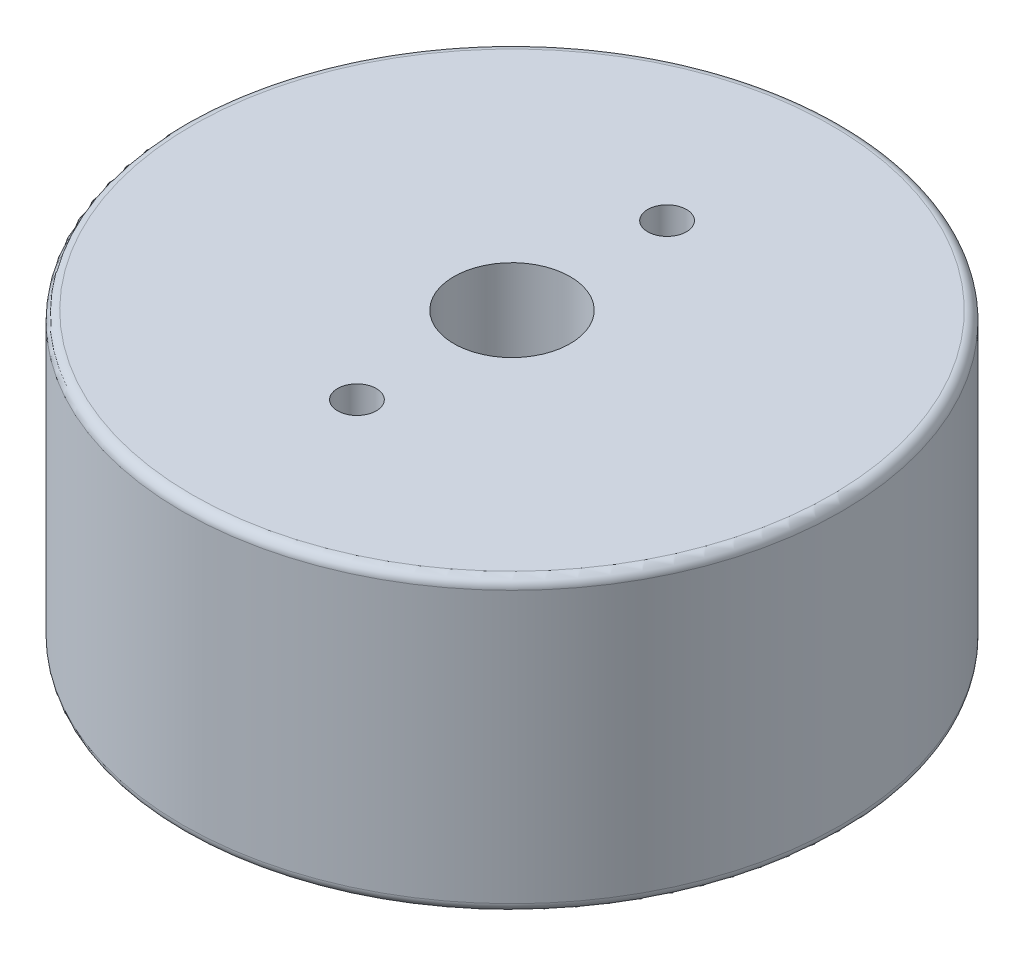
ISO-10303-21;
HEADER;
FILE_DESCRIPTION(('STEP AP214'),'2;1');
FILE_NAME('part.step','',(''),(''),'','','');
FILE_SCHEMA(('AUTOMOTIVE_DESIGN { 1 0 10303 214 1 1 1 1 }'));
ENDSEC;
DATA;
#1=APPLICATION_CONTEXT('core data for automotive mechanical design processes');
#2=APPLICATION_PROTOCOL_DEFINITION('international standard','automotive_design',2000,#1);
#3=PRODUCT_CONTEXT('',#1,'mechanical');
#4=PRODUCT('Part','Part','',(#3));
#5=PRODUCT_RELATED_PRODUCT_CATEGORY('part','',(#4));
#6=PRODUCT_DEFINITION_FORMATION('','',#4);
#7=PRODUCT_DEFINITION_CONTEXT('part definition',#1,'design');
#8=PRODUCT_DEFINITION('design','',#6,#7);
#9=PRODUCT_DEFINITION_SHAPE('','',#8);
#10=(LENGTH_UNIT() NAMED_UNIT(*) SI_UNIT(.MILLI.,.METRE.));
#11=(NAMED_UNIT(*) PLANE_ANGLE_UNIT() SI_UNIT($,.RADIAN.));
#12=(NAMED_UNIT(*) SI_UNIT($,.STERADIAN.) SOLID_ANGLE_UNIT());
#13=UNCERTAINTY_MEASURE_WITH_UNIT(LENGTH_MEASURE(1.E-05),#10,'distance_accuracy_value','');
#14=(GEOMETRIC_REPRESENTATION_CONTEXT(3) GLOBAL_UNCERTAINTY_ASSIGNED_CONTEXT((#13)) GLOBAL_UNIT_ASSIGNED_CONTEXT((#10,
#11,#12)) REPRESENTATION_CONTEXT('',''));
#15=CARTESIAN_POINT('',(0.,0.,0.));
#16=DIRECTION('',(0.,0.,1.));
#17=DIRECTION('',(1.,0.,0.));
#18=AXIS2_PLACEMENT_3D('',#15,#16,#17);
#19=CARTESIAN_POINT('',(0.,15.,0.));
#20=DIRECTION('',(0.,-1.,0.));
#21=DIRECTION('',(0.,0.,-1.));
#22=AXIS2_PLACEMENT_3D('',#19,#20,#21);
#23=CYLINDRICAL_SURFACE('',#22,17.);
#24=CARTESIAN_POINT('',(0.,0.5,0.));
#25=DIRECTION('',(0.,1.,0.));
#26=DIRECTION('',(0.,0.,1.));
#27=AXIS2_PLACEMENT_3D('',#24,#25,#26);
#28=CIRCLE('',#27,17.);
#29=CARTESIAN_POINT('',(0.,0.5,17.));
#30=VERTEX_POINT('',#29);
#31=EDGE_CURVE('E48',#30,#30,#28,.T.);
#32=ORIENTED_EDGE('',*,*,#31,.T.);
#33=EDGE_LOOP('',(#32));
#34=FACE_BOUND('',#33,.T.);
#35=CARTESIAN_POINT('',(0.,14.5,0.));
#36=DIRECTION('',(0.,1.,0.));
#37=DIRECTION('',(0.,0.,1.));
#38=AXIS2_PLACEMENT_3D('',#35,#36,#37);
#39=CIRCLE('',#38,17.);
#40=CARTESIAN_POINT('',(0.,14.5,17.));
#41=VERTEX_POINT('',#40);
#42=EDGE_CURVE('E52',#41,#41,#39,.F.);
#43=ORIENTED_EDGE('',*,*,#42,.T.);
#44=EDGE_LOOP('',(#43));
#45=FACE_BOUND('',#44,.T.);
#46=ADVANCED_FACE('F37',(#34,#45),#23,.T.);
#47=CARTESIAN_POINT('',(0.,15.,0.));
#48=DIRECTION('',(0.,1.,0.));
#49=DIRECTION('',(0.,0.,1.));
#50=AXIS2_PLACEMENT_3D('',#47,#48,#49);
#51=PLANE('',#50);
#52=CARTESIAN_POINT('',(0.,15.,0.));
#53=DIRECTION('',(0.,1.,0.));
#54=DIRECTION('',(0.,0.,1.));
#55=AXIS2_PLACEMENT_3D('',#52,#53,#54);
#56=CIRCLE('',#55,16.5);
#57=CARTESIAN_POINT('',(0.,15.,16.5));
#58=VERTEX_POINT('',#57);
#59=EDGE_CURVE('E10',#58,#58,#56,.T.);
#60=ORIENTED_EDGE('',*,*,#59,.T.);
#61=EDGE_LOOP('',(#60));
#62=FACE_BOUND('',#61,.T.);
#63=CARTESIAN_POINT('',(0.,15.,0.));
#64=DIRECTION('',(0.,1.,0.));
#65=DIRECTION('',(0.,0.,1.));
#66=AXIS2_PLACEMENT_3D('',#63,#64,#65);
#67=CIRCLE('',#66,3.);
#68=CARTESIAN_POINT('',(0.,15.,-3.));
#69=VERTEX_POINT('',#68);
#70=EDGE_CURVE('E94',#69,#69,#67,.F.);
#71=ORIENTED_EDGE('',*,*,#70,.T.);
#72=EDGE_LOOP('',(#71));
#73=FACE_BOUND('',#72,.T.);
#74=CARTESIAN_POINT('',(0.,15.,-8.));
#75=DIRECTION('',(0.,1.,0.));
#76=DIRECTION('',(0.,0.,1.));
#77=AXIS2_PLACEMENT_3D('',#74,#75,#76);
#78=CIRCLE('',#77,1.);
#79=CARTESIAN_POINT('',(0.,15.,-7.));
#80=VERTEX_POINT('',#79);
#81=EDGE_CURVE('E65',#80,#80,#78,.T.);
#82=ORIENTED_EDGE('',*,*,#81,.F.);
#83=EDGE_LOOP('',(#82));
#84=FACE_BOUND('',#83,.T.);
#85=CARTESIAN_POINT('',(0.,15.,8.));
#86=DIRECTION('',(0.,1.,0.));
#87=DIRECTION('',(0.,0.,1.));
#88=AXIS2_PLACEMENT_3D('',#85,#86,#87);
#89=CIRCLE('',#88,1.);
#90=CARTESIAN_POINT('',(0.,15.,9.));
#91=VERTEX_POINT('',#90);
#92=EDGE_CURVE('E61',#91,#91,#89,.T.);
#93=ORIENTED_EDGE('',*,*,#92,.F.);
#94=EDGE_LOOP('',(#93));
#95=FACE_BOUND('',#94,.T.);
#96=ADVANCED_FACE('F106',(#62,#73,#84,#95),#51,.T.);
#97=CARTESIAN_POINT('',(0.,0.,0.));
#98=DIRECTION('',(0.,1.,0.));
#99=DIRECTION('',(0.,0.,1.));
#100=AXIS2_PLACEMENT_3D('',#97,#98,#99);
#101=PLANE('',#100);
#102=CARTESIAN_POINT('',(0.,0.,0.));
#103=DIRECTION('',(0.,1.,0.));
#104=DIRECTION('',(0.,0.,1.));
#105=AXIS2_PLACEMENT_3D('',#102,#103,#104);
#106=CIRCLE('',#105,16.5);
#107=CARTESIAN_POINT('',(0.,0.,16.5));
#108=VERTEX_POINT('',#107);
#109=EDGE_CURVE('E44',#108,#108,#106,.F.);
#110=ORIENTED_EDGE('',*,*,#109,.T.);
#111=EDGE_LOOP('',(#110));
#112=FACE_BOUND('',#111,.T.);
#113=CARTESIAN_POINT('',(0.,0.,0.));
#114=DIRECTION('',(0.,-1.,0.));
#115=DIRECTION('',(0.,0.,-1.));
#116=AXIS2_PLACEMENT_3D('',#113,#114,#115);
#117=CIRCLE('',#116,3.);
#118=CARTESIAN_POINT('',(0.,0.,-3.));
#119=VERTEX_POINT('',#118);
#120=EDGE_CURVE('E74',#119,#119,#117,.T.);
#121=ORIENTED_EDGE('',*,*,#120,.F.);
#122=EDGE_LOOP('',(#121));
#123=FACE_BOUND('',#122,.T.);
#124=CARTESIAN_POINT('',(0.,0.,8.));
#125=DIRECTION('',(0.,-1.,0.));
#126=DIRECTION('',(0.,0.,-1.));
#127=AXIS2_PLACEMENT_3D('',#124,#125,#126);
#128=CIRCLE('',#127,1.5);
#129=CARTESIAN_POINT('',(0.,0.,6.5));
#130=VERTEX_POINT('',#129);
#131=EDGE_CURVE('E89',#130,#130,#128,.T.);
#132=ORIENTED_EDGE('',*,*,#131,.F.);
#133=EDGE_LOOP('',(#132));
#134=FACE_BOUND('',#133,.T.);
#135=CARTESIAN_POINT('',(8.,0.,0.));
#136=DIRECTION('',(0.,-1.,0.));
#137=DIRECTION('',(0.,0.,-1.));
#138=AXIS2_PLACEMENT_3D('',#135,#136,#137);
#139=CIRCLE('',#138,1.5);
#140=CARTESIAN_POINT('',(8.,0.,-1.5));
#141=VERTEX_POINT('',#140);
#142=EDGE_CURVE('E86',#141,#141,#139,.T.);
#143=ORIENTED_EDGE('',*,*,#142,.F.);
#144=EDGE_LOOP('',(#143));
#145=FACE_BOUND('',#144,.T.);
#146=CARTESIAN_POINT('',(0.,0.,-8.));
#147=DIRECTION('',(0.,-1.,0.));
#148=DIRECTION('',(0.,0.,-1.));
#149=AXIS2_PLACEMENT_3D('',#146,#147,#148);
#150=CIRCLE('',#149,1.5);
#151=CARTESIAN_POINT('',(0.,0.,-9.5));
#152=VERTEX_POINT('',#151);
#153=EDGE_CURVE('E80',#152,#152,#150,.T.);
#154=ORIENTED_EDGE('',*,*,#153,.F.);
#155=EDGE_LOOP('',(#154));
#156=FACE_BOUND('',#155,.T.);
#157=CARTESIAN_POINT('',(-8.,0.,0.));
#158=DIRECTION('',(0.,-1.,0.));
#159=DIRECTION('',(0.,0.,-1.));
#160=AXIS2_PLACEMENT_3D('',#157,#158,#159);
#161=CIRCLE('',#160,1.5);
#162=CARTESIAN_POINT('',(-8.,0.,-1.5));
#163=VERTEX_POINT('',#162);
#164=EDGE_CURVE('E73',#163,#163,#161,.T.);
#165=ORIENTED_EDGE('',*,*,#164,.F.);
#166=EDGE_LOOP('',(#165));
#167=FACE_BOUND('',#166,.T.);
#168=ADVANCED_FACE('F102',(#112,#123,#134,#145,#156,#167),#101,.F.);
#169=CARTESIAN_POINT('',(0.,5.,8.));
#170=DIRECTION('',(0.,1.,0.));
#171=DIRECTION('',(0.,0.,1.));
#172=AXIS2_PLACEMENT_3D('',#169,#170,#171);
#173=CYLINDRICAL_SURFACE('',#172,1.);
#174=CARTESIAN_POINT('',(0.,5.,8.));
#175=DIRECTION('',(0.,1.,0.));
#176=DIRECTION('',(0.,0.,1.));
#177=AXIS2_PLACEMENT_3D('',#174,#175,#176);
#178=CIRCLE('',#177,1.);
#179=CARTESIAN_POINT('',(0.,5.,9.));
#180=VERTEX_POINT('',#179);
#181=EDGE_CURVE('E58',#180,#180,#178,.T.);
#182=ORIENTED_EDGE('',*,*,#181,.F.);
#183=EDGE_LOOP('',(#182));
#184=FACE_BOUND('',#183,.T.);
#185=ORIENTED_EDGE('',*,*,#92,.T.);
#186=EDGE_LOOP('',(#185));
#187=FACE_BOUND('',#186,.T.);
#188=ADVANCED_FACE('F105',(#184,#187),#173,.F.);
#189=CARTESIAN_POINT('',(0.,5.,8.));
#190=DIRECTION('',(0.,1.,0.));
#191=DIRECTION('',(0.,0.,1.));
#192=AXIS2_PLACEMENT_3D('',#189,#190,#191);
#193=PLANE('',#192);
#194=ORIENTED_EDGE('',*,*,#181,.T.);
#195=EDGE_LOOP('',(#194));
#196=FACE_BOUND('',#195,.T.);
#197=ADVANCED_FACE('F291',(#196),#193,.T.);
#198=CARTESIAN_POINT('',(0.,5.,-8.));
#199=DIRECTION('',(0.,1.,0.));
#200=DIRECTION('',(0.,0.,1.));
#201=AXIS2_PLACEMENT_3D('',#198,#199,#200);
#202=CYLINDRICAL_SURFACE('',#201,1.);
#203=CARTESIAN_POINT('',(0.,5.,-8.));
#204=DIRECTION('',(0.,1.,0.));
#205=DIRECTION('',(0.,0.,1.));
#206=AXIS2_PLACEMENT_3D('',#203,#204,#205);
#207=CIRCLE('',#206,1.);
#208=CARTESIAN_POINT('',(0.,5.,-7.));
#209=VERTEX_POINT('',#208);
#210=EDGE_CURVE('E57',#209,#209,#207,.T.);
#211=ORIENTED_EDGE('',*,*,#210,.F.);
#212=EDGE_LOOP('',(#211));
#213=FACE_BOUND('',#212,.T.);
#214=ORIENTED_EDGE('',*,*,#81,.T.);
#215=EDGE_LOOP('',(#214));
#216=FACE_BOUND('',#215,.T.);
#217=ADVANCED_FACE('F129',(#213,#216),#202,.F.);
#218=CARTESIAN_POINT('',(0.,5.,-8.));
#219=DIRECTION('',(0.,1.,0.));
#220=DIRECTION('',(0.,0.,1.));
#221=AXIS2_PLACEMENT_3D('',#218,#219,#220);
#222=PLANE('',#221);
#223=ORIENTED_EDGE('',*,*,#210,.T.);
#224=EDGE_LOOP('',(#223));
#225=FACE_BOUND('',#224,.T.);
#226=ADVANCED_FACE('F119',(#225),#222,.T.);
#227=CARTESIAN_POINT('',(-8.,2.,0.));
#228=DIRECTION('',(0.,-1.,0.));
#229=DIRECTION('',(0.,0.,-1.));
#230=AXIS2_PLACEMENT_3D('',#227,#228,#229);
#231=CYLINDRICAL_SURFACE('',#230,1.5);
#232=CARTESIAN_POINT('',(-8.,2.,0.));
#233=DIRECTION('',(0.,-1.,0.));
#234=DIRECTION('',(0.,0.,-1.));
#235=AXIS2_PLACEMENT_3D('',#232,#233,#234);
#236=CIRCLE('',#235,1.5);
#237=CARTESIAN_POINT('',(-8.,2.,-1.5));
#238=VERTEX_POINT('',#237);
#239=EDGE_CURVE('E70',#238,#238,#236,.T.);
#240=ORIENTED_EDGE('',*,*,#239,.F.);
#241=EDGE_LOOP('',(#240));
#242=FACE_BOUND('',#241,.T.);
#243=ORIENTED_EDGE('',*,*,#164,.T.);
#244=EDGE_LOOP('',(#243));
#245=FACE_BOUND('',#244,.T.);
#246=ADVANCED_FACE('F116',(#242,#245),#231,.F.);
#247=CARTESIAN_POINT('',(-8.,2.,0.));
#248=DIRECTION('',(0.,-1.,0.));
#249=DIRECTION('',(0.,0.,-1.));
#250=AXIS2_PLACEMENT_3D('',#247,#248,#249);
#251=PLANE('',#250);
#252=ORIENTED_EDGE('',*,*,#239,.T.);
#253=EDGE_LOOP('',(#252));
#254=FACE_BOUND('',#253,.T.);
#255=ADVANCED_FACE('F118',(#254),#251,.T.);
#256=CARTESIAN_POINT('',(0.,2.,-8.));
#257=DIRECTION('',(0.,-1.,0.));
#258=DIRECTION('',(0.,0.,-1.));
#259=AXIS2_PLACEMENT_3D('',#256,#257,#258);
#260=CYLINDRICAL_SURFACE('',#259,1.5);
#261=CARTESIAN_POINT('',(0.,2.,-8.));
#262=DIRECTION('',(0.,-1.,0.));
#263=DIRECTION('',(0.,0.,-1.));
#264=AXIS2_PLACEMENT_3D('',#261,#262,#263);
#265=CIRCLE('',#264,1.5);
#266=CARTESIAN_POINT('',(0.,2.,-9.5));
#267=VERTEX_POINT('',#266);
#268=EDGE_CURVE('E77',#267,#267,#265,.T.);
#269=ORIENTED_EDGE('',*,*,#268,.F.);
#270=EDGE_LOOP('',(#269));
#271=FACE_BOUND('',#270,.T.);
#272=ORIENTED_EDGE('',*,*,#153,.T.);
#273=EDGE_LOOP('',(#272));
#274=FACE_BOUND('',#273,.T.);
#275=ADVANCED_FACE('F126',(#271,#274),#260,.F.);
#276=CARTESIAN_POINT('',(0.,2.,-8.));
#277=DIRECTION('',(0.,-1.,0.));
#278=DIRECTION('',(0.,0.,-1.));
#279=AXIS2_PLACEMENT_3D('',#276,#277,#278);
#280=PLANE('',#279);
#281=ORIENTED_EDGE('',*,*,#268,.T.);
#282=EDGE_LOOP('',(#281));
#283=FACE_BOUND('',#282,.T.);
#284=ADVANCED_FACE('F170',(#283),#280,.T.);
#285=CARTESIAN_POINT('',(8.,2.,0.));
#286=DIRECTION('',(0.,-1.,0.));
#287=DIRECTION('',(0.,0.,-1.));
#288=AXIS2_PLACEMENT_3D('',#285,#286,#287);
#289=CYLINDRICAL_SURFACE('',#288,1.5);
#290=CARTESIAN_POINT('',(8.,2.,0.));
#291=DIRECTION('',(0.,-1.,0.));
#292=DIRECTION('',(0.,0.,-1.));
#293=AXIS2_PLACEMENT_3D('',#290,#291,#292);
#294=CIRCLE('',#293,1.5);
#295=CARTESIAN_POINT('',(8.,2.,-1.5));
#296=VERTEX_POINT('',#295);
#297=EDGE_CURVE('E83',#296,#296,#294,.T.);
#298=ORIENTED_EDGE('',*,*,#297,.F.);
#299=EDGE_LOOP('',(#298));
#300=FACE_BOUND('',#299,.T.);
#301=ORIENTED_EDGE('',*,*,#142,.T.);
#302=EDGE_LOOP('',(#301));
#303=FACE_BOUND('',#302,.T.);
#304=ADVANCED_FACE('F167',(#300,#303),#289,.F.);
#305=CARTESIAN_POINT('',(8.,2.,0.));
#306=DIRECTION('',(0.,-1.,0.));
#307=DIRECTION('',(0.,0.,-1.));
#308=AXIS2_PLACEMENT_3D('',#305,#306,#307);
#309=PLANE('',#308);
#310=ORIENTED_EDGE('',*,*,#297,.T.);
#311=EDGE_LOOP('',(#310));
#312=FACE_BOUND('',#311,.T.);
#313=ADVANCED_FACE('F165',(#312),#309,.T.);
#314=CARTESIAN_POINT('',(0.,2.,8.));
#315=DIRECTION('',(0.,-1.,0.));
#316=DIRECTION('',(0.,0.,-1.));
#317=AXIS2_PLACEMENT_3D('',#314,#315,#316);
#318=CYLINDRICAL_SURFACE('',#317,1.5);
#319=CARTESIAN_POINT('',(0.,2.,8.));
#320=DIRECTION('',(0.,-1.,0.));
#321=DIRECTION('',(0.,0.,-1.));
#322=AXIS2_PLACEMENT_3D('',#319,#320,#321);
#323=CIRCLE('',#322,1.5);
#324=CARTESIAN_POINT('',(0.,2.,6.5));
#325=VERTEX_POINT('',#324);
#326=EDGE_CURVE('E62',#325,#325,#323,.T.);
#327=ORIENTED_EDGE('',*,*,#326,.F.);
#328=EDGE_LOOP('',(#327));
#329=FACE_BOUND('',#328,.T.);
#330=ORIENTED_EDGE('',*,*,#131,.T.);
#331=EDGE_LOOP('',(#330));
#332=FACE_BOUND('',#331,.T.);
#333=ADVANCED_FACE('F158',(#329,#332),#318,.F.);
#334=CARTESIAN_POINT('',(0.,2.,8.));
#335=DIRECTION('',(0.,-1.,0.));
#336=DIRECTION('',(0.,0.,-1.));
#337=AXIS2_PLACEMENT_3D('',#334,#335,#336);
#338=PLANE('',#337);
#339=ORIENTED_EDGE('',*,*,#326,.T.);
#340=EDGE_LOOP('',(#339));
#341=FACE_BOUND('',#340,.T.);
#342=ADVANCED_FACE('F150',(#341),#338,.T.);
#343=CARTESIAN_POINT('',(0.,15.001,0.));
#344=DIRECTION('',(0.,-1.,0.));
#345=DIRECTION('',(0.,0.,-1.));
#346=AXIS2_PLACEMENT_3D('',#343,#344,#345);
#347=CYLINDRICAL_SURFACE('',#346,3.);
#348=CARTESIAN_POINT('',(0.,15.,-3.));
#349=CARTESIAN_POINT('',(0.,14.84375,-3.));
#350=CARTESIAN_POINT('',(0.,14.6875,-3.));
#351=CARTESIAN_POINT('',(0.,14.375,-3.));
#352=CARTESIAN_POINT('',(0.,14.21875,-3.));
#353=CARTESIAN_POINT('',(0.,13.90625,-3.));
#354=CARTESIAN_POINT('',(0.,13.75,-3.));
#355=CARTESIAN_POINT('',(0.,13.4375,-3.));
#356=CARTESIAN_POINT('',(0.,13.28125,-3.));
#357=CARTESIAN_POINT('',(0.,12.96875,-3.));
#358=CARTESIAN_POINT('',(0.,12.8125,-3.));
#359=CARTESIAN_POINT('',(0.,12.5,-3.));
#360=CARTESIAN_POINT('',(0.,12.34375,-3.));
#361=CARTESIAN_POINT('',(0.,12.03125,-3.));
#362=CARTESIAN_POINT('',(0.,11.875,-3.));
#363=CARTESIAN_POINT('',(0.,11.5625,-3.));
#364=CARTESIAN_POINT('',(0.,11.40625,-3.));
#365=CARTESIAN_POINT('',(0.,11.09375,-3.));
#366=CARTESIAN_POINT('',(0.,10.9375,-3.));
#367=CARTESIAN_POINT('',(0.,10.625,-3.));
#368=CARTESIAN_POINT('',(0.,10.46875,-3.));
#369=CARTESIAN_POINT('',(0.,10.15625,-3.));
#370=CARTESIAN_POINT('',(0.,10.,-3.));
#371=CARTESIAN_POINT('',(0.,9.6875,-3.));
#372=CARTESIAN_POINT('',(0.,9.53125,-3.));
#373=CARTESIAN_POINT('',(0.,9.21875,-3.));
#374=CARTESIAN_POINT('',(0.,9.0625,-3.));
#375=CARTESIAN_POINT('',(0.,8.75,-3.));
#376=CARTESIAN_POINT('',(0.,8.59375,-3.));
#377=CARTESIAN_POINT('',(0.,8.28125,-3.));
#378=CARTESIAN_POINT('',(0.,8.125,-3.));
#379=CARTESIAN_POINT('',(0.,7.8125,-3.));
#380=CARTESIAN_POINT('',(0.,7.65625,-3.));
#381=CARTESIAN_POINT('',(0.,7.34375,-3.));
#382=CARTESIAN_POINT('',(0.,7.1875,-3.));
#383=CARTESIAN_POINT('',(0.,6.875,-3.));
#384=CARTESIAN_POINT('',(0.,6.71875,-3.));
#385=CARTESIAN_POINT('',(0.,6.40625,-3.));
#386=CARTESIAN_POINT('',(0.,6.25,-3.));
#387=CARTESIAN_POINT('',(0.,5.9375,-3.));
#388=CARTESIAN_POINT('',(0.,5.78125,-3.));
#389=CARTESIAN_POINT('',(0.,5.46875,-3.));
#390=CARTESIAN_POINT('',(0.,5.3125,-3.));
#391=CARTESIAN_POINT('',(0.,5.,-3.));
#392=CARTESIAN_POINT('',(0.,4.84375,-3.));
#393=CARTESIAN_POINT('',(0.,4.53125,-3.));
#394=CARTESIAN_POINT('',(0.,4.375,-3.));
#395=CARTESIAN_POINT('',(0.,4.0625,-3.));
#396=CARTESIAN_POINT('',(0.,3.90625,-3.));
#397=CARTESIAN_POINT('',(0.,3.59375,-3.));
#398=CARTESIAN_POINT('',(0.,3.4375,-3.));
#399=CARTESIAN_POINT('',(0.,3.125,-3.));
#400=CARTESIAN_POINT('',(0.,2.96875,-3.));
#401=CARTESIAN_POINT('',(0.,2.65625,-3.));
#402=CARTESIAN_POINT('',(0.,2.5,-3.));
#403=CARTESIAN_POINT('',(0.,2.1875,-3.));
#404=CARTESIAN_POINT('',(0.,2.03125,-3.));
#405=CARTESIAN_POINT('',(0.,1.71875,-3.));
#406=CARTESIAN_POINT('',(0.,1.5625,-3.));
#407=CARTESIAN_POINT('',(0.,1.25,-3.));
#408=CARTESIAN_POINT('',(0.,1.09375,-3.));
#409=CARTESIAN_POINT('',(0.,0.781250000000001,-3.));
#410=CARTESIAN_POINT('',(0.,0.625000000000001,-3.));
#411=CARTESIAN_POINT('',(0.,0.3125,-3.));
#412=CARTESIAN_POINT('',(0.,0.15625,-3.));
#413=CARTESIAN_POINT('',(0.,0.,-3.));
#414=B_SPLINE_CURVE_WITH_KNOTS('',3,(#348,#349,#350,#351,#352,#353,#354,#355,#356,#357,#358,
#359,#360,#361,#362,#363,#364,#365,#366,#367,#368,#369,#370,#371,#372,#373,#374,#375,#376,#377,
#378,#379,#380,#381,#382,#383,#384,#385,#386,#387,#388,#389,#390,#391,#392,#393,#394,#395,#396,
#397,#398,#399,#400,#401,#402,#403,#404,#405,#406,#407,#408,#409,#410,#411,#412,#413),
.UNSPECIFIED.,.F.,.F.,(4,2,2,2,2,2,2,2,2,2,2,2,2,2,2,2,2,2,2,2,2,2,2,2,2,2,2,2,2,2,2,2,4),(0.,
0.468749999999999,0.937499999999999,1.40625,1.875,2.34375,2.8125,3.28125,3.75,4.21875,4.6875,
5.15625,5.625,6.09375,6.5625,7.03125,7.5,7.96875,8.4375,8.90625,9.375,9.84375,10.3125,10.78125,
11.25,11.71875,12.1875,12.65625,13.125,13.59375,14.0625,14.53125,15.),.UNSPECIFIED.);
#415=EDGE_CURVE('BSEAM100',#69,#119,#414,.T.);
#416=ORIENTED_EDGE('',*,*,#70,.F.);
#417=ORIENTED_EDGE('',*,*,#120,.T.);
#418=ORIENTED_EDGE('',*,*,#415,.T.);
#419=ORIENTED_EDGE('',*,*,#415,.F.);
#420=EDGE_LOOP('',(#416,#418,#417,#419));
#421=FACE_BOUND('',#420,.T.);
#422=ADVANCED_FACE('F100',(#421),#347,.F.);
#423=CARTESIAN_POINT('',(0.,0.5,0.));
#424=DIRECTION('',(0.,1.,0.));
#425=DIRECTION('',(0.,0.,1.));
#426=AXIS2_PLACEMENT_3D('',#423,#424,#425);
#427=TOROIDAL_SURFACE('',#426,16.5,0.5);
#428=ORIENTED_EDGE('',*,*,#109,.F.);
#429=EDGE_LOOP('',(#428));
#430=FACE_BOUND('',#429,.T.);
#431=ORIENTED_EDGE('',*,*,#31,.F.);
#432=EDGE_LOOP('',(#431));
#433=FACE_BOUND('',#432,.T.);
#434=ADVANCED_FACE('F142',(#430,#433),#427,.T.);
#435=CARTESIAN_POINT('',(0.,14.5,0.));
#436=DIRECTION('',(0.,1.,0.));
#437=DIRECTION('',(0.,0.,1.));
#438=AXIS2_PLACEMENT_3D('',#435,#436,#437);
#439=TOROIDAL_SURFACE('',#438,16.5,0.5);
#440=ORIENTED_EDGE('',*,*,#42,.F.);
#441=EDGE_LOOP('',(#440));
#442=FACE_BOUND('',#441,.T.);
#443=ORIENTED_EDGE('',*,*,#59,.F.);
#444=EDGE_LOOP('',(#443));
#445=FACE_BOUND('',#444,.T.);
#446=ADVANCED_FACE('F39',(#442,#445),#439,.T.);
#447=CLOSED_SHELL('',(#46,#96,#168,#188,#197,#217,#226,#246,#255,#275,#284,#304,#313,#333,#342,
#422,#434,#446));
#448=MANIFOLD_SOLID_BREP('B2',#447);
#449=ADVANCED_BREP_SHAPE_REPRESENTATION('',(#18,#448),#14);
#450=SHAPE_DEFINITION_REPRESENTATION(#9,#449);
ENDSEC;
END-ISO-10303-21;
